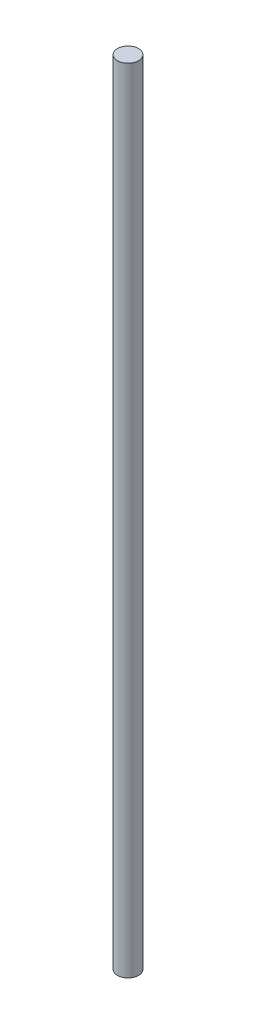
ISO-10303-21;
HEADER;
FILE_DESCRIPTION(('STEP AP214'),'2;1');
FILE_NAME('part.step','',(''),(''),'','','');
FILE_SCHEMA(('AUTOMOTIVE_DESIGN { 1 0 10303 214 1 1 1 1 }'));
ENDSEC;
DATA;
#1=APPLICATION_CONTEXT('core data for automotive mechanical design processes');
#2=APPLICATION_PROTOCOL_DEFINITION('international standard','automotive_design',2000,#1);
#3=PRODUCT_CONTEXT('',#1,'mechanical');
#4=PRODUCT('Part','Part','',(#3));
#5=PRODUCT_RELATED_PRODUCT_CATEGORY('part','',(#4));
#6=PRODUCT_DEFINITION_FORMATION('','',#4);
#7=PRODUCT_DEFINITION_CONTEXT('part definition',#1,'design');
#8=PRODUCT_DEFINITION('design','',#6,#7);
#9=PRODUCT_DEFINITION_SHAPE('','',#8);
#10=(LENGTH_UNIT() NAMED_UNIT(*) SI_UNIT(.MILLI.,.METRE.));
#11=(NAMED_UNIT(*) PLANE_ANGLE_UNIT() SI_UNIT($,.RADIAN.));
#12=(NAMED_UNIT(*) SI_UNIT($,.STERADIAN.) SOLID_ANGLE_UNIT());
#13=UNCERTAINTY_MEASURE_WITH_UNIT(LENGTH_MEASURE(1.E-05),#10,'distance_accuracy_value','');
#14=(GEOMETRIC_REPRESENTATION_CONTEXT(3) GLOBAL_UNCERTAINTY_ASSIGNED_CONTEXT((#13)) GLOBAL_UNIT_ASSIGNED_CONTEXT((#10,
#11,#12)) REPRESENTATION_CONTEXT('',''));
#15=CARTESIAN_POINT('',(0.,0.,0.));
#16=DIRECTION('',(0.,0.,1.));
#17=DIRECTION('',(1.,0.,0.));
#18=AXIS2_PLACEMENT_3D('',#15,#16,#17);
#19=CARTESIAN_POINT('',(0.,308.559868421053,0.));
#20=DIRECTION('',(0.,1.,0.));
#21=DIRECTION('',(0.,0.,1.));
#22=AXIS2_PLACEMENT_3D('',#19,#20,#21);
#23=PLANE('',#22);
#24=CARTESIAN_POINT('',(0.,308.559868421053,0.));
#25=DIRECTION('',(0.,-1.,0.));
#26=DIRECTION('',(0.,0.,-1.));
#27=AXIS2_PLACEMENT_3D('',#24,#25,#26);
#28=CIRCLE('',#27,5.08);
#29=CARTESIAN_POINT('',(0.,308.559868421053,-5.08));
#30=VERTEX_POINT('',#29);
#31=EDGE_CURVE('E10',#30,#30,#28,.T.);
#32=ORIENTED_EDGE('',*,*,#31,.F.);
#33=EDGE_LOOP('',(#32));
#34=FACE_BOUND('',#33,.T.);
#35=ADVANCED_FACE('F30',(#34),#23,.T.);
#36=CARTESIAN_POINT('',(0.,-72.4401315789474,0.));
#37=DIRECTION('',(0.,-1.,0.));
#38=DIRECTION('',(0.,0.,-1.));
#39=AXIS2_PLACEMENT_3D('',#36,#37,#38);
#40=CYLINDRICAL_SURFACE('',#39,5.08000000000002);
#41=ORIENTED_EDGE('',*,*,#31,.T.);
#42=EDGE_LOOP('',(#41));
#43=FACE_BOUND('',#42,.T.);
#44=CARTESIAN_POINT('',(0.,-72.4401315789474,0.));
#45=DIRECTION('',(0.,-1.,0.));
#46=DIRECTION('',(0.,0.,-1.));
#47=AXIS2_PLACEMENT_3D('',#44,#45,#46);
#48=CIRCLE('',#47,5.08000000000005);
#49=CARTESIAN_POINT('',(0.,-72.4401315789474,-5.08000000000005));
#50=VERTEX_POINT('',#49);
#51=EDGE_CURVE('E36',#50,#50,#48,.T.);
#52=ORIENTED_EDGE('',*,*,#51,.F.);
#53=EDGE_LOOP('',(#52));
#54=FACE_BOUND('',#53,.T.);
#55=ADVANCED_FACE('F44',(#43,#54),#40,.T.);
#56=CARTESIAN_POINT('',(5.08000000000005,-72.4401315789474,0.));
#57=DIRECTION('',(0.,-1.,0.));
#58=DIRECTION('',(0.,0.,-1.));
#59=AXIS2_PLACEMENT_3D('',#56,#57,#58);
#60=PLANE('',#59);
#61=ORIENTED_EDGE('',*,*,#51,.T.);
#62=EDGE_LOOP('',(#61));
#63=FACE_BOUND('',#62,.T.);
#64=ADVANCED_FACE('F42',(#63),#60,.T.);
#65=CLOSED_SHELL('',(#35,#55,#64));
#66=MANIFOLD_SOLID_BREP('B2',#65);
#67=ADVANCED_BREP_SHAPE_REPRESENTATION('',(#18,#66),#14);
#68=SHAPE_DEFINITION_REPRESENTATION(#9,#67);
ENDSEC;
END-ISO-10303-21;
